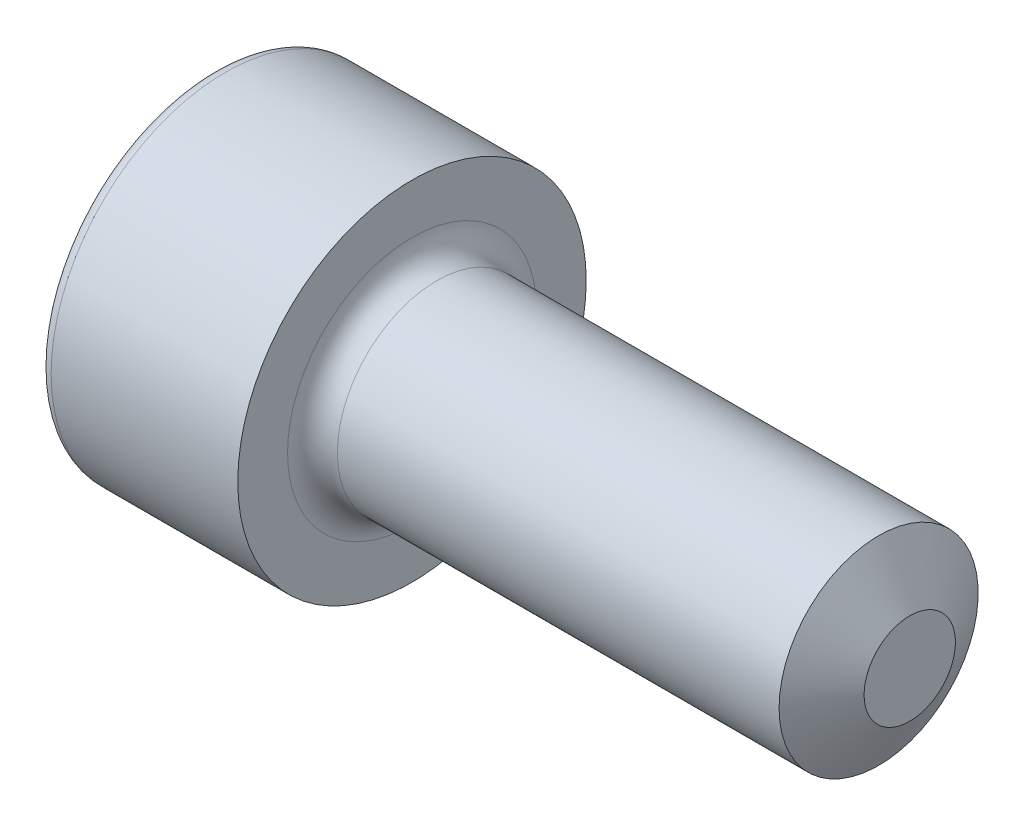
ISO-10303-21;
HEADER;
FILE_DESCRIPTION(('STEP AP214'),'2;1');
FILE_NAME('part.step','',(''),(''),'','','');
FILE_SCHEMA(('AUTOMOTIVE_DESIGN { 1 0 10303 214 1 1 1 1 }'));
ENDSEC;
DATA;
#1=APPLICATION_CONTEXT('core data for automotive mechanical design processes');
#2=APPLICATION_PROTOCOL_DEFINITION('international standard','automotive_design',2000,#1);
#3=PRODUCT_CONTEXT('',#1,'mechanical');
#4=PRODUCT('Part','Part','',(#3));
#5=PRODUCT_RELATED_PRODUCT_CATEGORY('part','',(#4));
#6=PRODUCT_DEFINITION_FORMATION('','',#4);
#7=PRODUCT_DEFINITION_CONTEXT('part definition',#1,'design');
#8=PRODUCT_DEFINITION('design','',#6,#7);
#9=PRODUCT_DEFINITION_SHAPE('','',#8);
#10=(LENGTH_UNIT() NAMED_UNIT(*) SI_UNIT(.MILLI.,.METRE.));
#11=(NAMED_UNIT(*) PLANE_ANGLE_UNIT() SI_UNIT($,.RADIAN.));
#12=(NAMED_UNIT(*) SI_UNIT($,.STERADIAN.) SOLID_ANGLE_UNIT());
#13=UNCERTAINTY_MEASURE_WITH_UNIT(LENGTH_MEASURE(1.E-05),#10,'distance_accuracy_value','');
#14=(GEOMETRIC_REPRESENTATION_CONTEXT(3) GLOBAL_UNCERTAINTY_ASSIGNED_CONTEXT((#13)) GLOBAL_UNIT_ASSIGNED_CONTEXT((#10,
#11,#12)) REPRESENTATION_CONTEXT('',''));
#15=CARTESIAN_POINT('',(0.,0.,0.));
#16=DIRECTION('',(0.,0.,1.));
#17=DIRECTION('',(1.,0.,0.));
#18=AXIS2_PLACEMENT_3D('',#15,#16,#17);
#19=CARTESIAN_POINT('',(0.,0.,0.));
#20=DIRECTION('',(-1.,0.,0.));
#21=DIRECTION('',(0.,0.,1.));
#22=AXIS2_PLACEMENT_3D('',#19,#20,#21);
#23=CYLINDRICAL_SURFACE('',#22,0.8);
#24=CARTESIAN_POINT('',(1.8,0.,0.));
#25=DIRECTION('',(-1.,0.,0.));
#26=DIRECTION('',(0.,0.,1.));
#27=AXIS2_PLACEMENT_3D('',#24,#25,#26);
#28=CIRCLE('',#27,0.8);
#29=CARTESIAN_POINT('',(1.8,0.,0.8));
#30=VERTEX_POINT('',#29);
#31=EDGE_CURVE('E114',#30,#30,#28,.T.);
#32=ORIENTED_EDGE('',*,*,#31,.F.);
#33=EDGE_LOOP('',(#32));
#34=FACE_BOUND('',#33,.T.);
#35=CARTESIAN_POINT('',(5.35000733344089,0.,0.));
#36=DIRECTION('',(-1.,0.,0.));
#37=DIRECTION('',(0.,0.,1.));
#38=AXIS2_PLACEMENT_3D('',#35,#36,#37);
#39=CIRCLE('',#38,0.8);
#40=CARTESIAN_POINT('',(5.35000733344089,0.,0.8));
#41=VERTEX_POINT('',#40);
#42=EDGE_CURVE('E296',#41,#41,#39,.T.);
#43=ORIENTED_EDGE('',*,*,#42,.T.);
#44=EDGE_LOOP('',(#43));
#45=FACE_BOUND('',#44,.T.);
#46=ADVANCED_FACE('F38',(#34,#45),#23,.T.);
#47=CARTESIAN_POINT('',(0.,0.,0.));
#48=DIRECTION('',(1.,0.,0.));
#49=DIRECTION('',(0.,0.,-1.));
#50=AXIS2_PLACEMENT_3D('',#47,#48,#49);
#51=PLANE('',#50);
#52=CARTESIAN_POINT('',(0.,0.,0.));
#53=DIRECTION('',(1.,0.,0.));
#54=DIRECTION('',(0.,0.,-1.));
#55=AXIS2_PLACEMENT_3D('',#52,#53,#54);
#56=CIRCLE('',#55,1.3);
#57=CARTESIAN_POINT('',(0.,0.,-1.3));
#58=VERTEX_POINT('',#57);
#59=EDGE_CURVE('E46',#58,#58,#56,.F.);
#60=ORIENTED_EDGE('',*,*,#59,.T.);
#61=EDGE_LOOP('',(#60));
#62=FACE_BOUND('',#61,.T.);
#63=DIRECTION('',(0.,0.866025403784439,-0.5));
#64=VECTOR('',#63,1.);
#65=CARTESIAN_POINT('',(0.,0.,0.8));
#66=LINE('',#65,#64);
#67=CARTESIAN_POINT('',(0.,0.,0.8));
#68=VERTEX_POINT('',#67);
#69=CARTESIAN_POINT('',(0.,0.692820323027551,0.4));
#70=VERTEX_POINT('',#69);
#71=EDGE_CURVE('E329',#68,#70,#66,.T.);
#72=ORIENTED_EDGE('',*,*,#71,.F.);
#73=DIRECTION('',(0.,0.866025403784439,0.5));
#74=VECTOR('',#73,1.);
#75=CARTESIAN_POINT('',(0.,-0.692820323027551,0.4));
#76=LINE('',#75,#74);
#77=CARTESIAN_POINT('',(0.,-0.692820323027551,0.4));
#78=VERTEX_POINT('',#77);
#79=EDGE_CURVE('E53',#78,#68,#76,.T.);
#80=ORIENTED_EDGE('',*,*,#79,.F.);
#81=DIRECTION('',(0.,0.,1.));
#82=VECTOR('',#81,1.);
#83=CARTESIAN_POINT('',(0.,-0.692820323027551,-0.4));
#84=LINE('',#83,#82);
#85=CARTESIAN_POINT('',(0.,-0.692820323027551,-0.4));
#86=VERTEX_POINT('',#85);
#87=EDGE_CURVE('E89',#86,#78,#84,.T.);
#88=ORIENTED_EDGE('',*,*,#87,.F.);
#89=DIRECTION('',(0.,-0.866025403784439,0.5));
#90=VECTOR('',#89,1.);
#91=CARTESIAN_POINT('',(0.,0.,-0.8));
#92=LINE('',#91,#90);
#93=CARTESIAN_POINT('',(0.,0.,-0.8));
#94=VERTEX_POINT('',#93);
#95=EDGE_CURVE('E97',#94,#86,#92,.T.);
#96=ORIENTED_EDGE('',*,*,#95,.F.);
#97=DIRECTION('',(0.,-0.866025403784439,-0.5));
#98=VECTOR('',#97,1.);
#99=CARTESIAN_POINT('',(0.,0.692820323027551,-0.4));
#100=LINE('',#99,#98);
#101=CARTESIAN_POINT('',(0.,0.692820323027551,-0.4));
#102=VERTEX_POINT('',#101);
#103=EDGE_CURVE('E103',#102,#94,#100,.T.);
#104=ORIENTED_EDGE('',*,*,#103,.F.);
#105=DIRECTION('',(0.,0.,-1.));
#106=VECTOR('',#105,1.);
#107=CARTESIAN_POINT('',(0.,0.692820323027551,0.4));
#108=LINE('',#107,#106);
#109=EDGE_CURVE('E332',#70,#102,#108,.T.);
#110=ORIENTED_EDGE('',*,*,#109,.F.);
#111=EDGE_LOOP('',(#72,#80,#88,#96,#104,#110));
#112=FACE_BOUND('',#111,.T.);
#113=ADVANCED_FACE('F106',(#62,#112),#51,.F.);
#114=CARTESIAN_POINT('',(0.,0.,0.));
#115=DIRECTION('',(-1.,0.,0.));
#116=DIRECTION('',(0.,0.,1.));
#117=AXIS2_PLACEMENT_3D('',#114,#115,#116);
#118=CYLINDRICAL_SURFACE('',#117,1.4);
#119=CARTESIAN_POINT('',(0.1,0.,0.));
#120=DIRECTION('',(1.,0.,0.));
#121=DIRECTION('',(0.,0.,-1.));
#122=AXIS2_PLACEMENT_3D('',#119,#120,#121);
#123=CIRCLE('',#122,1.4);
#124=CARTESIAN_POINT('',(0.1,0.,-1.4));
#125=VERTEX_POINT('',#124);
#126=EDGE_CURVE('E11',#125,#125,#123,.T.);
#127=ORIENTED_EDGE('',*,*,#126,.T.);
#128=EDGE_LOOP('',(#127));
#129=FACE_BOUND('',#128,.T.);
#130=CARTESIAN_POINT('',(1.6,0.,0.));
#131=DIRECTION('',(-1.,0.,0.));
#132=DIRECTION('',(0.,0.,1.));
#133=AXIS2_PLACEMENT_3D('',#130,#131,#132);
#134=CIRCLE('',#133,1.4);
#135=CARTESIAN_POINT('',(1.6,0.,1.4));
#136=VERTEX_POINT('',#135);
#137=EDGE_CURVE('E128',#136,#136,#134,.T.);
#138=ORIENTED_EDGE('',*,*,#137,.T.);
#139=EDGE_LOOP('',(#138));
#140=FACE_BOUND('',#139,.T.);
#141=ADVANCED_FACE('F151',(#129,#140),#118,.T.);
#142=CARTESIAN_POINT('',(1.6,1.4,0.));
#143=DIRECTION('',(-1.,0.,0.));
#144=DIRECTION('',(0.,0.,1.));
#145=AXIS2_PLACEMENT_3D('',#142,#143,#144);
#146=PLANE('',#145);
#147=ORIENTED_EDGE('',*,*,#137,.F.);
#148=EDGE_LOOP('',(#147));
#149=FACE_BOUND('',#148,.T.);
#150=CARTESIAN_POINT('',(1.6,0.,0.));
#151=DIRECTION('',(-1.,0.,0.));
#152=DIRECTION('',(0.,0.,1.));
#153=AXIS2_PLACEMENT_3D('',#150,#151,#152);
#154=CIRCLE('',#153,1.);
#155=CARTESIAN_POINT('',(1.6,0.,1.));
#156=VERTEX_POINT('',#155);
#157=EDGE_CURVE('E125',#156,#156,#154,.T.);
#158=ORIENTED_EDGE('',*,*,#157,.T.);
#159=EDGE_LOOP('',(#158));
#160=FACE_BOUND('',#159,.T.);
#161=ADVANCED_FACE('F160',(#149,#160),#146,.F.);
#162=CARTESIAN_POINT('',(1.8,0.,0.));
#163=DIRECTION('',(-1.,0.,0.));
#164=DIRECTION('',(0.,0.,1.));
#165=AXIS2_PLACEMENT_3D('',#162,#163,#164);
#166=TOROIDAL_SURFACE('',#165,1.,0.2);
#167=ORIENTED_EDGE('',*,*,#157,.F.);
#168=EDGE_LOOP('',(#167));
#169=FACE_BOUND('',#168,.T.);
#170=ORIENTED_EDGE('',*,*,#31,.T.);
#171=EDGE_LOOP('',(#170));
#172=FACE_BOUND('',#171,.T.);
#173=ADVANCED_FACE('F156',(#169,#172),#166,.F.);
#174=CARTESIAN_POINT('',(1.,-0.692820323027551,0.4));
#175=DIRECTION('',(0.,-0.5,0.866025403784439));
#176=DIRECTION('',(0.,-0.866025403784439,-0.5));
#177=AXIS2_PLACEMENT_3D('',#174,#175,#176);
#178=PLANE('',#177);
#179=ORIENTED_EDGE('',*,*,#79,.T.);
#180=DIRECTION('',(-1.,0.,0.));
#181=VECTOR('',#180,1.);
#182=CARTESIAN_POINT('',(1.,0.,0.8));
#183=LINE('',#182,#181);
#184=CARTESIAN_POINT('',(1.,0.,0.799999999999999));
#185=VERTEX_POINT('',#184);
#186=EDGE_CURVE('E121',#185,#68,#183,.T.);
#187=ORIENTED_EDGE('',*,*,#186,.F.);
#188=DIRECTION('',(0.,0.866025403784439,0.5));
#189=VECTOR('',#188,1.);
#190=CARTESIAN_POINT('',(1.,-0.692820323027551,0.4));
#191=LINE('',#190,#189);
#192=CARTESIAN_POINT('',(1.,-0.692820323027551,0.4));
#193=VERTEX_POINT('',#192);
#194=EDGE_CURVE('E107',#193,#185,#191,.T.);
#195=ORIENTED_EDGE('',*,*,#194,.F.);
#196=DIRECTION('',(-1.,0.,0.));
#197=VECTOR('',#196,1.);
#198=CARTESIAN_POINT('',(1.,-0.692820323027551,0.4));
#199=LINE('',#198,#197);
#200=EDGE_CURVE('E93',#193,#78,#199,.T.);
#201=ORIENTED_EDGE('',*,*,#200,.T.);
#202=EDGE_LOOP('',(#179,#187,#195,#201));
#203=FACE_BOUND('',#202,.T.);
#204=ADVANCED_FACE('F159',(#203),#178,.F.);
#205=CARTESIAN_POINT('',(1.,-0.692820323027551,-0.4));
#206=DIRECTION('',(0.,-1.,0.));
#207=DIRECTION('',(0.,0.,-1.));
#208=AXIS2_PLACEMENT_3D('',#205,#206,#207);
#209=PLANE('',#208);
#210=ORIENTED_EDGE('',*,*,#87,.T.);
#211=ORIENTED_EDGE('',*,*,#200,.F.);
#212=DIRECTION('',(0.,0.,1.));
#213=VECTOR('',#212,1.);
#214=CARTESIAN_POINT('',(1.,-0.692820323027551,-0.4));
#215=LINE('',#214,#213);
#216=CARTESIAN_POINT('',(1.,-0.692820323027551,-0.4));
#217=VERTEX_POINT('',#216);
#218=EDGE_CURVE('E90',#217,#193,#215,.T.);
#219=ORIENTED_EDGE('',*,*,#218,.F.);
#220=DIRECTION('',(-1.,0.,0.));
#221=VECTOR('',#220,1.);
#222=CARTESIAN_POINT('',(1.,-0.692820323027551,-0.4));
#223=LINE('',#222,#221);
#224=EDGE_CURVE('E84',#217,#86,#223,.T.);
#225=ORIENTED_EDGE('',*,*,#224,.T.);
#226=EDGE_LOOP('',(#210,#211,#219,#225));
#227=FACE_BOUND('',#226,.T.);
#228=ADVANCED_FACE('F86',(#227),#209,.F.);
#229=CARTESIAN_POINT('',(1.,0.,-0.8));
#230=DIRECTION('',(0.,-0.5,-0.866025403784439));
#231=DIRECTION('',(0.,0.866025403784439,-0.5));
#232=AXIS2_PLACEMENT_3D('',#229,#230,#231);
#233=PLANE('',#232);
#234=ORIENTED_EDGE('',*,*,#95,.T.);
#235=ORIENTED_EDGE('',*,*,#224,.F.);
#236=DIRECTION('',(0.,-0.866025403784439,0.5));
#237=VECTOR('',#236,1.);
#238=CARTESIAN_POINT('',(1.,0.,-0.8));
#239=LINE('',#238,#237);
#240=CARTESIAN_POINT('',(1.,0.,-0.8));
#241=VERTEX_POINT('',#240);
#242=EDGE_CURVE('E325',#241,#217,#239,.T.);
#243=ORIENTED_EDGE('',*,*,#242,.F.);
#244=DIRECTION('',(-1.,0.,0.));
#245=VECTOR('',#244,1.);
#246=CARTESIAN_POINT('',(1.,0.,-0.8));
#247=LINE('',#246,#245);
#248=EDGE_CURVE('E94',#241,#94,#247,.T.);
#249=ORIENTED_EDGE('',*,*,#248,.T.);
#250=EDGE_LOOP('',(#234,#235,#243,#249));
#251=FACE_BOUND('',#250,.T.);
#252=ADVANCED_FACE('F98',(#251),#233,.F.);
#253=CARTESIAN_POINT('',(1.,0.692820323027551,-0.4));
#254=DIRECTION('',(0.,0.5,-0.866025403784439));
#255=DIRECTION('',(0.,0.866025403784439,0.5));
#256=AXIS2_PLACEMENT_3D('',#253,#254,#255);
#257=PLANE('',#256);
#258=ORIENTED_EDGE('',*,*,#103,.T.);
#259=ORIENTED_EDGE('',*,*,#248,.F.);
#260=DIRECTION('',(0.,-0.866025403784439,-0.5));
#261=VECTOR('',#260,1.);
#262=CARTESIAN_POINT('',(1.,0.692820323027551,-0.4));
#263=LINE('',#262,#261);
#264=CARTESIAN_POINT('',(1.,0.692820323027551,-0.4));
#265=VERTEX_POINT('',#264);
#266=EDGE_CURVE('E322',#265,#241,#263,.T.);
#267=ORIENTED_EDGE('',*,*,#266,.F.);
#268=DIRECTION('',(-1.,0.,0.));
#269=VECTOR('',#268,1.);
#270=CARTESIAN_POINT('',(1.,0.692820323027551,-0.4));
#271=LINE('',#270,#269);
#272=EDGE_CURVE('E117',#265,#102,#271,.T.);
#273=ORIENTED_EDGE('',*,*,#272,.T.);
#274=EDGE_LOOP('',(#258,#259,#267,#273));
#275=FACE_BOUND('',#274,.T.);
#276=ADVANCED_FACE('F201',(#275),#257,.F.);
#277=CARTESIAN_POINT('',(1.,0.692820323027551,0.4));
#278=DIRECTION('',(0.,1.,0.));
#279=DIRECTION('',(0.,0.,1.));
#280=AXIS2_PLACEMENT_3D('',#277,#278,#279);
#281=PLANE('',#280);
#282=ORIENTED_EDGE('',*,*,#109,.T.);
#283=ORIENTED_EDGE('',*,*,#272,.F.);
#284=DIRECTION('',(0.,0.,-1.));
#285=VECTOR('',#284,1.);
#286=CARTESIAN_POINT('',(1.,0.692820323027551,0.4));
#287=LINE('',#286,#285);
#288=CARTESIAN_POINT('',(1.,0.692820323027551,0.4));
#289=VERTEX_POINT('',#288);
#290=EDGE_CURVE('E319',#289,#265,#287,.T.);
#291=ORIENTED_EDGE('',*,*,#290,.F.);
#292=DIRECTION('',(-1.,0.,0.));
#293=VECTOR('',#292,1.);
#294=CARTESIAN_POINT('',(1.,0.692820323027551,0.4));
#295=LINE('',#294,#293);
#296=EDGE_CURVE('E119',#289,#70,#295,.T.);
#297=ORIENTED_EDGE('',*,*,#296,.T.);
#298=EDGE_LOOP('',(#282,#283,#291,#297));
#299=FACE_BOUND('',#298,.T.);
#300=ADVANCED_FACE('F208',(#299),#281,.F.);
#301=CARTESIAN_POINT('',(1.,0.,0.8));
#302=DIRECTION('',(0.,0.5,0.866025403784439));
#303=DIRECTION('',(0.,-0.866025403784439,0.5));
#304=AXIS2_PLACEMENT_3D('',#301,#302,#303);
#305=PLANE('',#304);
#306=ORIENTED_EDGE('',*,*,#71,.T.);
#307=ORIENTED_EDGE('',*,*,#296,.F.);
#308=DIRECTION('',(0.,0.866025403784439,-0.5));
#309=VECTOR('',#308,1.);
#310=CARTESIAN_POINT('',(1.,0.,0.8));
#311=LINE('',#310,#309);
#312=EDGE_CURVE('E110',#185,#289,#311,.T.);
#313=ORIENTED_EDGE('',*,*,#312,.F.);
#314=ORIENTED_EDGE('',*,*,#186,.T.);
#315=EDGE_LOOP('',(#306,#307,#313,#314));
#316=FACE_BOUND('',#315,.T.);
#317=ADVANCED_FACE('F216',(#316),#305,.F.);
#318=CARTESIAN_POINT('',(1.,-0.692820323027551,-0.4));
#319=DIRECTION('',(-0.995370003024138,0.0480587064945768,0.0832401213946473));
#320=DIRECTION('',(0.0833364155569767,0.,0.996521470838494));
#321=AXIS2_PLACEMENT_3D('',#318,#319,#320);
#322=PLANE('',#321);
#323=DIRECTION('',(-0.0833364155569768,-0.863012909162769,-0.498260735419247));
#324=VECTOR('',#323,1.);
#325=CARTESIAN_POINT('',(1.06690185249043,0.,0.));
#326=LINE('',#325,#324);
#327=CARTESIAN_POINT('',(1.06690185249043,0.,0.));
#328=VERTEX_POINT('',#327);
#329=EDGE_CURVE('E62',#328,#217,#326,.T.);
#330=ORIENTED_EDGE('',*,*,#329,.F.);
#331=DIRECTION('',(-0.0833364155569767,0.,-0.996521470838494));
#332=VECTOR('',#331,1.);
#333=CARTESIAN_POINT('',(1.06690185249043,0.,0.));
#334=LINE('',#333,#332);
#335=EDGE_CURVE('E305',#328,#241,#334,.T.);
#336=ORIENTED_EDGE('',*,*,#335,.T.);
#337=ORIENTED_EDGE('',*,*,#242,.T.);
#338=EDGE_LOOP('',(#330,#336,#337));
#339=FACE_BOUND('',#338,.T.);
#340=ADVANCED_FACE('F224',(#339),#322,.T.);
#341=CARTESIAN_POINT('',(1.,0.,-0.8));
#342=DIRECTION('',(-0.995370003024138,-0.0480587064945768,0.0832401213946474));
#343=DIRECTION('',(0.0833364155569767,0.,0.996521470838494));
#344=AXIS2_PLACEMENT_3D('',#341,#342,#343);
#345=PLANE('',#344);
#346=ORIENTED_EDGE('',*,*,#335,.F.);
#347=DIRECTION('',(-0.0833364155569767,0.863012909162769,-0.498260735419247));
#348=VECTOR('',#347,1.);
#349=CARTESIAN_POINT('',(1.06690185249043,0.,0.));
#350=LINE('',#349,#348);
#351=EDGE_CURVE('E309',#328,#265,#350,.T.);
#352=ORIENTED_EDGE('',*,*,#351,.T.);
#353=ORIENTED_EDGE('',*,*,#266,.T.);
#354=EDGE_LOOP('',(#346,#352,#353));
#355=FACE_BOUND('',#354,.T.);
#356=ADVANCED_FACE('F232',(#355),#345,.T.);
#357=CARTESIAN_POINT('',(1.,-0.692820323027551,0.4));
#358=DIRECTION('',(-0.995370003024138,0.0961174129891536,0.));
#359=DIRECTION('',(-0.0961174129891536,-0.995370003024138,0.));
#360=AXIS2_PLACEMENT_3D('',#357,#358,#359);
#361=PLANE('',#360);
#362=DIRECTION('',(-0.0833364155569767,-0.863012909162769,0.498260735419247));
#363=VECTOR('',#362,1.);
#364=CARTESIAN_POINT('',(1.06690185249043,0.,0.));
#365=LINE('',#364,#363);
#366=EDGE_CURVE('E312',#328,#193,#365,.T.);
#367=ORIENTED_EDGE('',*,*,#366,.F.);
#368=ORIENTED_EDGE('',*,*,#329,.T.);
#369=ORIENTED_EDGE('',*,*,#218,.T.);
#370=EDGE_LOOP('',(#367,#368,#369));
#371=FACE_BOUND('',#370,.T.);
#372=ADVANCED_FACE('F240',(#371),#361,.T.);
#373=CARTESIAN_POINT('',(1.,0.692820323027551,-0.4));
#374=DIRECTION('',(-0.995370003024138,-0.0961174129891535,0.));
#375=DIRECTION('',(0.0961174129891535,-0.995370003024138,0.));
#376=AXIS2_PLACEMENT_3D('',#373,#374,#375);
#377=PLANE('',#376);
#378=ORIENTED_EDGE('',*,*,#351,.F.);
#379=DIRECTION('',(-0.0833364155569767,0.86301290916277,0.498260735419246));
#380=VECTOR('',#379,1.);
#381=CARTESIAN_POINT('',(1.06690185249043,0.,0.));
#382=LINE('',#381,#380);
#383=EDGE_CURVE('E300',#328,#289,#382,.T.);
#384=ORIENTED_EDGE('',*,*,#383,.T.);
#385=ORIENTED_EDGE('',*,*,#290,.T.);
#386=EDGE_LOOP('',(#378,#384,#385));
#387=FACE_BOUND('',#386,.T.);
#388=ADVANCED_FACE('F248',(#387),#377,.T.);
#389=CARTESIAN_POINT('',(1.,0.,0.799999999999999));
#390=DIRECTION('',(-0.995370003024138,0.0480587064945768,-0.0832401213946474));
#391=DIRECTION('',(-0.0833364155569768,0.,0.996521470838494));
#392=AXIS2_PLACEMENT_3D('',#389,#390,#391);
#393=PLANE('',#392);
#394=DIRECTION('',(-0.0833364155569768,0.,0.996521470838494));
#395=VECTOR('',#394,1.);
#396=CARTESIAN_POINT('',(1.06690185249043,0.,0.));
#397=LINE('',#396,#395);
#398=EDGE_CURVE('E295',#328,#185,#397,.T.);
#399=ORIENTED_EDGE('',*,*,#398,.F.);
#400=ORIENTED_EDGE('',*,*,#366,.T.);
#401=ORIENTED_EDGE('',*,*,#194,.T.);
#402=EDGE_LOOP('',(#399,#400,#401));
#403=FACE_BOUND('',#402,.T.);
#404=ADVANCED_FACE('F255',(#403),#393,.T.);
#405=CARTESIAN_POINT('',(1.,0.692820323027551,0.4));
#406=DIRECTION('',(-0.995370003024138,-0.0480587064945768,-0.0832401213946474));
#407=DIRECTION('',(-0.0833364155569768,0.,0.996521470838494));
#408=AXIS2_PLACEMENT_3D('',#405,#406,#407);
#409=PLANE('',#408);
#410=ORIENTED_EDGE('',*,*,#383,.F.);
#411=ORIENTED_EDGE('',*,*,#398,.T.);
#412=ORIENTED_EDGE('',*,*,#312,.T.);
#413=EDGE_LOOP('',(#410,#411,#412));
#414=FACE_BOUND('',#413,.T.);
#415=ADVANCED_FACE('F263',(#414),#409,.T.);
#416=CARTESIAN_POINT('',(5.35000733344089,0.,0.));
#417=DIRECTION('',(-1.,0.,0.));
#418=DIRECTION('',(0.,0.,1.));
#419=AXIS2_PLACEMENT_3D('',#416,#417,#418);
#420=CONICAL_SURFACE('',#419,0.8,1.04719755119659);
#421=CARTESIAN_POINT('',(5.6,0.,0.));
#422=DIRECTION('',(-1.,0.,0.));
#423=DIRECTION('',(0.,0.,1.));
#424=AXIS2_PLACEMENT_3D('',#421,#422,#423);
#425=CIRCLE('',#424,0.367);
#426=CARTESIAN_POINT('',(5.6,0.,0.367));
#427=VERTEX_POINT('',#426);
#428=EDGE_CURVE('E292',#427,#427,#425,.T.);
#429=ORIENTED_EDGE('',*,*,#428,.T.);
#430=EDGE_LOOP('',(#429));
#431=FACE_BOUND('',#430,.T.);
#432=ORIENTED_EDGE('',*,*,#42,.F.);
#433=EDGE_LOOP('',(#432));
#434=FACE_BOUND('',#433,.T.);
#435=ADVANCED_FACE('F141',(#431,#434),#420,.T.);
#436=CARTESIAN_POINT('',(5.6,0.8,0.));
#437=DIRECTION('',(-1.,0.,0.));
#438=DIRECTION('',(0.,0.,1.));
#439=AXIS2_PLACEMENT_3D('',#436,#437,#438);
#440=PLANE('',#439);
#441=ORIENTED_EDGE('',*,*,#428,.F.);
#442=EDGE_LOOP('',(#441));
#443=FACE_BOUND('',#442,.T.);
#444=ADVANCED_FACE('F136',(#443),#440,.F.);
#445=CARTESIAN_POINT('',(0.1,0.,0.));
#446=DIRECTION('',(1.,0.,0.));
#447=DIRECTION('',(0.,0.,-1.));
#448=AXIS2_PLACEMENT_3D('',#445,#446,#447);
#449=TOROIDAL_SURFACE('',#448,1.3,0.1);
#450=ORIENTED_EDGE('',*,*,#126,.F.);
#451=EDGE_LOOP('',(#450));
#452=FACE_BOUND('',#451,.T.);
#453=ORIENTED_EDGE('',*,*,#59,.F.);
#454=EDGE_LOOP('',(#453));
#455=FACE_BOUND('',#454,.T.);
#456=ADVANCED_FACE('F40',(#452,#455),#449,.T.);
#457=CLOSED_SHELL('',(#46,#113,#141,#161,#173,#204,#228,#252,#276,#300,#317,#340,#356,#372,#388,
#404,#415,#435,#444,#456));
#458=MANIFOLD_SOLID_BREP('B2',#457);
#459=ADVANCED_BREP_SHAPE_REPRESENTATION('',(#18,#458),#14);
#460=SHAPE_DEFINITION_REPRESENTATION(#9,#459);
ENDSEC;
END-ISO-10303-21;
